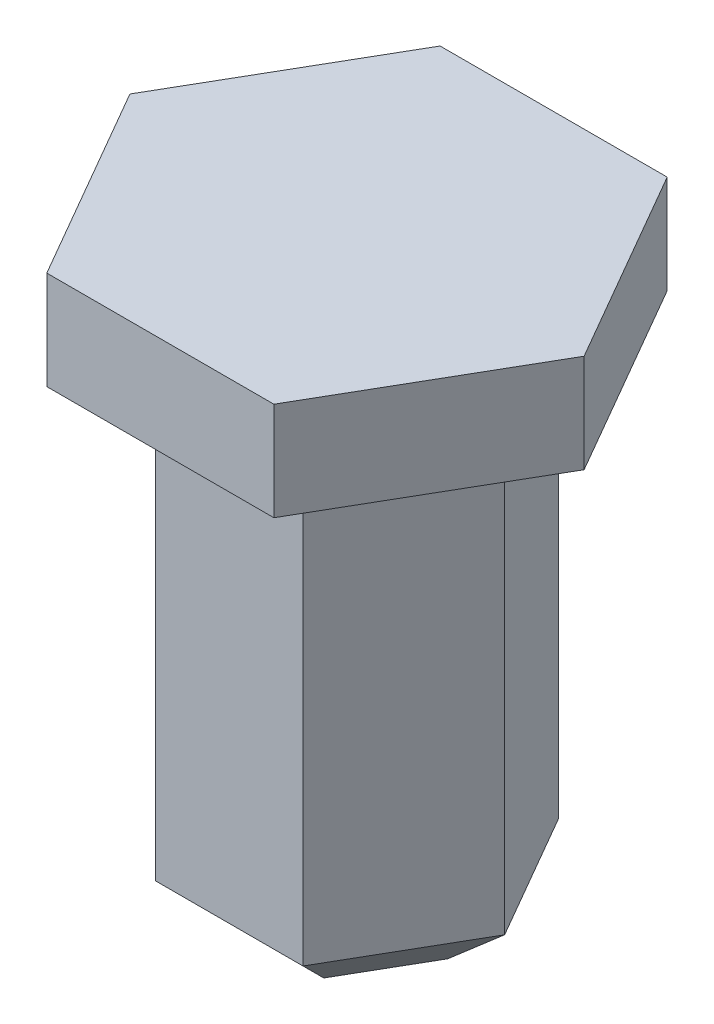
ISO-10303-21;
HEADER;
FILE_DESCRIPTION(('STEP AP214'),'2;1');
FILE_NAME('part.step','',(''),(''),'','','');
FILE_SCHEMA(('AUTOMOTIVE_DESIGN { 1 0 10303 214 1 1 1 1 }'));
ENDSEC;
DATA;
#1=APPLICATION_CONTEXT('core data for automotive mechanical design processes');
#2=APPLICATION_PROTOCOL_DEFINITION('international standard','automotive_design',2000,#1);
#3=PRODUCT_CONTEXT('',#1,'mechanical');
#4=PRODUCT('Part','Part','',(#3));
#5=PRODUCT_RELATED_PRODUCT_CATEGORY('part','',(#4));
#6=PRODUCT_DEFINITION_FORMATION('','',#4);
#7=PRODUCT_DEFINITION_CONTEXT('part definition',#1,'design');
#8=PRODUCT_DEFINITION('design','',#6,#7);
#9=PRODUCT_DEFINITION_SHAPE('','',#8);
#10=(LENGTH_UNIT() NAMED_UNIT(*) SI_UNIT(.MILLI.,.METRE.));
#11=(NAMED_UNIT(*) PLANE_ANGLE_UNIT() SI_UNIT($,.RADIAN.));
#12=(NAMED_UNIT(*) SI_UNIT($,.STERADIAN.) SOLID_ANGLE_UNIT());
#13=UNCERTAINTY_MEASURE_WITH_UNIT(LENGTH_MEASURE(1.E-05),#10,'distance_accuracy_value','');
#14=(GEOMETRIC_REPRESENTATION_CONTEXT(3) GLOBAL_UNCERTAINTY_ASSIGNED_CONTEXT((#13)) GLOBAL_UNIT_ASSIGNED_CONTEXT((#10,
#11,#12)) REPRESENTATION_CONTEXT('',''));
#15=CARTESIAN_POINT('',(0.,0.,0.));
#16=DIRECTION('',(0.,0.,1.));
#17=DIRECTION('',(1.,0.,0.));
#18=AXIS2_PLACEMENT_3D('',#15,#16,#17);
#19=CARTESIAN_POINT('',(0.750555349946526,5.,1.29999999999999));
#20=DIRECTION('',(-0.866025403784441,0.,-0.499999999999995));
#21=DIRECTION('',(-0.499999999999995,0.,0.866025403784441));
#22=AXIS2_PLACEMENT_3D('',#19,#20,#21);
#23=PLANE('',#22);
#24=DIRECTION('',(0.,-1.,0.));
#25=VECTOR('',#24,1.);
#26=CARTESIAN_POINT('',(0.750555349946526,5.,1.29999999999999));
#27=LINE('',#26,#25);
#28=CARTESIAN_POINT('',(0.750555349946526,5.,1.29999999999999));
#29=VERTEX_POINT('',#28);
#30=CARTESIAN_POINT('',(0.750555349946526,0.499999999999998,1.29999999999999));
#31=VERTEX_POINT('',#30);
#32=EDGE_CURVE('E193',#29,#31,#27,.T.);
#33=ORIENTED_EDGE('',*,*,#32,.T.);
#34=DIRECTION('',(0.499999999999995,0.,-0.866025403784441));
#35=VECTOR('',#34,1.);
#36=CARTESIAN_POINT('',(0.750555349946526,0.499999999999998,1.29999999999999));
#37=LINE('',#36,#35);
#38=CARTESIAN_POINT('',(1.50111069989302,0.499999999999998,0.));
#39=VERTEX_POINT('',#38);
#40=EDGE_CURVE('E11',#31,#39,#37,.T.);
#41=ORIENTED_EDGE('',*,*,#40,.T.);
#42=DIRECTION('',(0.,-1.,0.));
#43=VECTOR('',#42,1.);
#44=CARTESIAN_POINT('',(1.50111069989302,5.,0.));
#45=LINE('',#44,#43);
#46=CARTESIAN_POINT('',(1.50111069989302,5.,0.));
#47=VERTEX_POINT('',#46);
#48=EDGE_CURVE('E205',#47,#39,#45,.T.);
#49=ORIENTED_EDGE('',*,*,#48,.F.);
#50=DIRECTION('',(0.499999999999995,0.,-0.866025403784441));
#51=VECTOR('',#50,1.);
#52=CARTESIAN_POINT('',(0.750555349946526,5.,1.29999999999999));
#53=LINE('',#52,#51);
#54=EDGE_CURVE('E170',#29,#47,#53,.T.);
#55=ORIENTED_EDGE('',*,*,#54,.F.);
#56=EDGE_LOOP('',(#33,#41,#49,#55));
#57=FACE_BOUND('',#56,.T.);
#58=ADVANCED_FACE('F35',(#57),#23,.F.);
#59=CARTESIAN_POINT('',(1.50111069989302,5.,0.));
#60=DIRECTION('',(-0.866025403784438,0.,0.500000000000001));
#61=DIRECTION('',(0.500000000000001,0.,0.866025403784438));
#62=AXIS2_PLACEMENT_3D('',#59,#60,#61);
#63=PLANE('',#62);
#64=ORIENTED_EDGE('',*,*,#48,.T.);
#65=DIRECTION('',(-0.500000000000001,0.,-0.866025403784438));
#66=VECTOR('',#65,1.);
#67=CARTESIAN_POINT('',(1.50111069989302,0.499999999999998,0.));
#68=LINE('',#67,#66);
#69=CARTESIAN_POINT('',(0.750555349946508,0.499999999999998,-1.3));
#70=VERTEX_POINT('',#69);
#71=EDGE_CURVE('E208',#39,#70,#68,.T.);
#72=ORIENTED_EDGE('',*,*,#71,.T.);
#73=DIRECTION('',(0.,-1.,0.));
#74=VECTOR('',#73,1.);
#75=CARTESIAN_POINT('',(0.750555349946508,5.,-1.3));
#76=LINE('',#75,#74);
#77=CARTESIAN_POINT('',(0.750555349946508,5.,-1.3));
#78=VERTEX_POINT('',#77);
#79=EDGE_CURVE('E202',#78,#70,#76,.T.);
#80=ORIENTED_EDGE('',*,*,#79,.F.);
#81=DIRECTION('',(-0.500000000000001,0.,-0.866025403784438));
#82=VECTOR('',#81,1.);
#83=CARTESIAN_POINT('',(1.50111069989302,5.,0.));
#84=LINE('',#83,#82);
#85=EDGE_CURVE('E173',#47,#78,#84,.T.);
#86=ORIENTED_EDGE('',*,*,#85,.F.);
#87=EDGE_LOOP('',(#64,#72,#80,#86));
#88=FACE_BOUND('',#87,.T.);
#89=ADVANCED_FACE('F303',(#88),#63,.F.);
#90=CARTESIAN_POINT('',(0.750555349946508,5.,-1.3));
#91=DIRECTION('',(0.,0.,1.));
#92=DIRECTION('',(1.,0.,0.));
#93=AXIS2_PLACEMENT_3D('',#90,#91,#92);
#94=PLANE('',#93);
#95=ORIENTED_EDGE('',*,*,#79,.T.);
#96=DIRECTION('',(-1.,0.,0.));
#97=VECTOR('',#96,1.);
#98=CARTESIAN_POINT('',(0.750555349946508,0.499999999999998,-1.3));
#99=LINE('',#98,#97);
#100=CARTESIAN_POINT('',(-0.750555349946517,0.499999999999998,-1.29999999999999));
#101=VERTEX_POINT('',#100);
#102=EDGE_CURVE('E224',#70,#101,#99,.T.);
#103=ORIENTED_EDGE('',*,*,#102,.T.);
#104=DIRECTION('',(0.,-1.,0.));
#105=VECTOR('',#104,1.);
#106=CARTESIAN_POINT('',(-0.750555349946517,5.,-1.29999999999999));
#107=LINE('',#106,#105);
#108=CARTESIAN_POINT('',(-0.750555349946517,5.,-1.29999999999999));
#109=VERTEX_POINT('',#108);
#110=EDGE_CURVE('E199',#109,#101,#107,.T.);
#111=ORIENTED_EDGE('',*,*,#110,.F.);
#112=DIRECTION('',(-1.,0.,0.));
#113=VECTOR('',#112,1.);
#114=CARTESIAN_POINT('',(0.750555349946508,5.,-1.3));
#115=LINE('',#114,#113);
#116=EDGE_CURVE('E181',#78,#109,#115,.T.);
#117=ORIENTED_EDGE('',*,*,#116,.F.);
#118=EDGE_LOOP('',(#95,#103,#111,#117));
#119=FACE_BOUND('',#118,.T.);
#120=ADVANCED_FACE('F309',(#119),#94,.F.);
#121=CARTESIAN_POINT('',(-0.750555349946517,5.,-1.29999999999999));
#122=DIRECTION('',(0.866025403784442,0.,0.499999999999995));
#123=DIRECTION('',(0.499999999999995,0.,-0.866025403784442));
#124=AXIS2_PLACEMENT_3D('',#121,#122,#123);
#125=PLANE('',#124);
#126=ORIENTED_EDGE('',*,*,#110,.T.);
#127=DIRECTION('',(-0.499999999999995,0.,0.866025403784442));
#128=VECTOR('',#127,1.);
#129=CARTESIAN_POINT('',(-0.750555349946517,0.499999999999998,-1.29999999999999));
#130=LINE('',#129,#128);
#131=CARTESIAN_POINT('',(-1.50111069989302,0.499999999999998,0.));
#132=VERTEX_POINT('',#131);
#133=EDGE_CURVE('E226',#101,#132,#130,.T.);
#134=ORIENTED_EDGE('',*,*,#133,.T.);
#135=DIRECTION('',(0.,-1.,0.));
#136=VECTOR('',#135,1.);
#137=CARTESIAN_POINT('',(-1.50111069989302,5.,0.));
#138=LINE('',#137,#136);
#139=CARTESIAN_POINT('',(-1.50111069989302,5.,0.));
#140=VERTEX_POINT('',#139);
#141=EDGE_CURVE('E197',#140,#132,#138,.T.);
#142=ORIENTED_EDGE('',*,*,#141,.F.);
#143=DIRECTION('',(-0.499999999999995,0.,0.866025403784442));
#144=VECTOR('',#143,1.);
#145=CARTESIAN_POINT('',(-0.750555349946517,5.,-1.29999999999999));
#146=LINE('',#145,#144);
#147=EDGE_CURVE('E184',#109,#140,#146,.T.);
#148=ORIENTED_EDGE('',*,*,#147,.F.);
#149=EDGE_LOOP('',(#126,#134,#142,#148));
#150=FACE_BOUND('',#149,.T.);
#151=ADVANCED_FACE('F372',(#150),#125,.F.);
#152=CARTESIAN_POINT('',(-1.50111069989302,5.,0.));
#153=DIRECTION('',(0.866025403784434,0.,-0.500000000000007));
#154=DIRECTION('',(-0.500000000000007,0.,-0.866025403784435));
#155=AXIS2_PLACEMENT_3D('',#152,#153,#154);
#156=PLANE('',#155);
#157=ORIENTED_EDGE('',*,*,#141,.T.);
#158=DIRECTION('',(0.500000000000007,0.,0.866025403784435));
#159=VECTOR('',#158,1.);
#160=CARTESIAN_POINT('',(-1.50111069989302,0.499999999999998,0.));
#161=LINE('',#160,#159);
#162=CARTESIAN_POINT('',(-0.750555349946499,0.499999999999998,1.3));
#163=VERTEX_POINT('',#162);
#164=EDGE_CURVE('E60',#132,#163,#161,.T.);
#165=ORIENTED_EDGE('',*,*,#164,.T.);
#166=DIRECTION('',(0.,-1.,0.));
#167=VECTOR('',#166,1.);
#168=CARTESIAN_POINT('',(-0.750555349946499,5.,1.3));
#169=LINE('',#168,#167);
#170=CARTESIAN_POINT('',(-0.750555349946499,5.,1.3));
#171=VERTEX_POINT('',#170);
#172=EDGE_CURVE('E195',#171,#163,#169,.T.);
#173=ORIENTED_EDGE('',*,*,#172,.F.);
#174=DIRECTION('',(0.500000000000007,0.,0.866025403784434));
#175=VECTOR('',#174,1.);
#176=CARTESIAN_POINT('',(-1.50111069989302,5.,0.));
#177=LINE('',#176,#175);
#178=EDGE_CURVE('E187',#140,#171,#177,.T.);
#179=ORIENTED_EDGE('',*,*,#178,.F.);
#180=EDGE_LOOP('',(#157,#165,#173,#179));
#181=FACE_BOUND('',#180,.T.);
#182=ADVANCED_FACE('F370',(#181),#156,.F.);
#183=CARTESIAN_POINT('',(-0.750555349946499,5.,1.3));
#184=DIRECTION('',(0.,0.,-1.));
#185=DIRECTION('',(-1.,0.,0.));
#186=AXIS2_PLACEMENT_3D('',#183,#184,#185);
#187=PLANE('',#186);
#188=ORIENTED_EDGE('',*,*,#172,.T.);
#189=DIRECTION('',(1.,0.,0.));
#190=VECTOR('',#189,1.);
#191=CARTESIAN_POINT('',(-0.750555349946499,0.499999999999998,1.3));
#192=LINE('',#191,#190);
#193=EDGE_CURVE('E45',#163,#31,#192,.T.);
#194=ORIENTED_EDGE('',*,*,#193,.T.);
#195=ORIENTED_EDGE('',*,*,#32,.F.);
#196=DIRECTION('',(1.,0.,0.));
#197=VECTOR('',#196,1.);
#198=CARTESIAN_POINT('',(-0.750555349946499,5.,1.3));
#199=LINE('',#198,#197);
#200=EDGE_CURVE('E190',#171,#29,#199,.T.);
#201=ORIENTED_EDGE('',*,*,#200,.F.);
#202=EDGE_LOOP('',(#188,#194,#195,#201));
#203=FACE_BOUND('',#202,.T.);
#204=ADVANCED_FACE('F367',(#203),#187,.F.);
#205=CARTESIAN_POINT('',(0.,0.,0.));
#206=DIRECTION('',(0.,1.,0.));
#207=DIRECTION('',(0.,0.,1.));
#208=AXIS2_PLACEMENT_3D('',#205,#206,#207);
#209=PLANE('',#208);
#210=DIRECTION('',(1.,0.,0.));
#211=VECTOR('',#210,1.);
#212=CARTESIAN_POINT('',(0.,0.,-0.799999999999995));
#213=LINE('',#212,#211);
#214=CARTESIAN_POINT('',(-0.461880215351701,0.,-0.799999999999993));
#215=VERTEX_POINT('',#214);
#216=CARTESIAN_POINT('',(0.461880215351696,0.,-0.799999999999996));
#217=VERTEX_POINT('',#216);
#218=EDGE_CURVE('E219',#215,#217,#213,.T.);
#219=ORIENTED_EDGE('',*,*,#218,.T.);
#220=DIRECTION('',(0.500000000000001,0.,0.866025403784438));
#221=VECTOR('',#220,1.);
#222=CARTESIAN_POINT('',(0.692820323027546,0.,-0.399999999999998));
#223=LINE('',#222,#221);
#224=CARTESIAN_POINT('',(0.923760430703397,0.,0.));
#225=VERTEX_POINT('',#224);
#226=EDGE_CURVE('E221',#217,#225,#223,.T.);
#227=ORIENTED_EDGE('',*,*,#226,.T.);
#228=DIRECTION('',(-0.499999999999995,0.,0.866025403784441));
#229=VECTOR('',#228,1.);
#230=CARTESIAN_POINT('',(0.692820323027553,0.,0.399999999999996));
#231=LINE('',#230,#229);
#232=CARTESIAN_POINT('',(0.461880215351709,0.,0.79999999999999));
#233=VERTEX_POINT('',#232);
#234=EDGE_CURVE('E211',#225,#233,#231,.T.);
#235=ORIENTED_EDGE('',*,*,#234,.T.);
#236=DIRECTION('',(-1.,0.,0.));
#237=VECTOR('',#236,1.);
#238=CARTESIAN_POINT('',(0.,0.,0.799999999999994));
#239=LINE('',#238,#237);
#240=CARTESIAN_POINT('',(-0.46188021535169,0.,0.799999999999999));
#241=VERTEX_POINT('',#240);
#242=EDGE_CURVE('E213',#233,#241,#239,.T.);
#243=ORIENTED_EDGE('',*,*,#242,.T.);
#244=DIRECTION('',(-0.500000000000007,0.,-0.866025403784435));
#245=VECTOR('',#244,1.);
#246=CARTESIAN_POINT('',(-0.692820323027543,0.,0.400000000000003));
#247=LINE('',#246,#245);
#248=CARTESIAN_POINT('',(-0.923760430703396,0.,0.));
#249=VERTEX_POINT('',#248);
#250=EDGE_CURVE('E215',#241,#249,#247,.T.);
#251=ORIENTED_EDGE('',*,*,#250,.T.);
#252=DIRECTION('',(0.499999999999995,0.,-0.866025403784442));
#253=VECTOR('',#252,1.);
#254=CARTESIAN_POINT('',(-0.692820323027549,0.,-0.399999999999993));
#255=LINE('',#254,#253);
#256=EDGE_CURVE('E217',#249,#215,#255,.T.);
#257=ORIENTED_EDGE('',*,*,#256,.T.);
#258=EDGE_LOOP('',(#219,#227,#235,#243,#251,#257));
#259=FACE_BOUND('',#258,.T.);
#260=ADVANCED_FACE('F357',(#259),#209,.F.);
#261=CARTESIAN_POINT('',(0.,5.,0.));
#262=DIRECTION('',(0.,1.,0.));
#263=DIRECTION('',(0.,0.,1.));
#264=AXIS2_PLACEMENT_3D('',#261,#262,#263);
#265=PLANE('',#264);
#266=DIRECTION('',(0.499999999999999,0.,-0.866025403784439));
#267=VECTOR('',#266,1.);
#268=CARTESIAN_POINT('',(1.15470053837925,5.,2.));
#269=LINE('',#268,#267);
#270=CARTESIAN_POINT('',(1.15470053837925,5.,2.));
#271=VERTEX_POINT('',#270);
#272=CARTESIAN_POINT('',(2.3094010767585,5.,0.));
#273=VERTEX_POINT('',#272);
#274=EDGE_CURVE('E169',#271,#273,#269,.T.);
#275=ORIENTED_EDGE('',*,*,#274,.F.);
#276=DIRECTION('',(1.,0.,0.));
#277=VECTOR('',#276,1.);
#278=CARTESIAN_POINT('',(-1.15470053837925,5.,2.));
#279=LINE('',#278,#277);
#280=CARTESIAN_POINT('',(-1.15470053837925,5.,2.));
#281=VERTEX_POINT('',#280);
#282=EDGE_CURVE('E165',#281,#271,#279,.T.);
#283=ORIENTED_EDGE('',*,*,#282,.F.);
#284=DIRECTION('',(0.5,0.,0.866025403784438));
#285=VECTOR('',#284,1.);
#286=CARTESIAN_POINT('',(-2.3094010767585,5.,0.));
#287=LINE('',#286,#285);
#288=CARTESIAN_POINT('',(-2.3094010767585,5.,0.));
#289=VERTEX_POINT('',#288);
#290=EDGE_CURVE('E259',#289,#281,#287,.T.);
#291=ORIENTED_EDGE('',*,*,#290,.F.);
#292=DIRECTION('',(-0.5,0.,0.866025403784439));
#293=VECTOR('',#292,1.);
#294=CARTESIAN_POINT('',(-1.15470053837925,5.,-2.));
#295=LINE('',#294,#293);
#296=CARTESIAN_POINT('',(-1.15470053837925,5.,-2.));
#297=VERTEX_POINT('',#296);
#298=EDGE_CURVE('E257',#297,#289,#295,.T.);
#299=ORIENTED_EDGE('',*,*,#298,.F.);
#300=DIRECTION('',(-1.,0.,0.));
#301=VECTOR('',#300,1.);
#302=CARTESIAN_POINT('',(1.15470053837925,5.,-2.));
#303=LINE('',#302,#301);
#304=CARTESIAN_POINT('',(1.15470053837925,5.,-2.));
#305=VERTEX_POINT('',#304);
#306=EDGE_CURVE('E251',#305,#297,#303,.T.);
#307=ORIENTED_EDGE('',*,*,#306,.F.);
#308=DIRECTION('',(-0.5,0.,-0.866025403784438));
#309=VECTOR('',#308,1.);
#310=CARTESIAN_POINT('',(2.3094010767585,5.,0.));
#311=LINE('',#310,#309);
#312=EDGE_CURVE('E249',#273,#305,#311,.T.);
#313=ORIENTED_EDGE('',*,*,#312,.F.);
#314=EDGE_LOOP('',(#275,#283,#291,#299,#307,#313));
#315=FACE_BOUND('',#314,.T.);
#316=ORIENTED_EDGE('',*,*,#200,.T.);
#317=ORIENTED_EDGE('',*,*,#54,.T.);
#318=ORIENTED_EDGE('',*,*,#85,.T.);
#319=ORIENTED_EDGE('',*,*,#116,.T.);
#320=ORIENTED_EDGE('',*,*,#147,.T.);
#321=ORIENTED_EDGE('',*,*,#178,.T.);
#322=EDGE_LOOP('',(#316,#317,#318,#319,#320,#321));
#323=FACE_BOUND('',#322,.T.);
#324=ADVANCED_FACE('F281',(#315,#323),#265,.F.);
#325=CARTESIAN_POINT('',(1.15470053837925,6.,2.));
#326=DIRECTION('',(-0.866025403784439,0.,-0.499999999999999));
#327=DIRECTION('',(-0.499999999999999,0.,0.866025403784439));
#328=AXIS2_PLACEMENT_3D('',#325,#326,#327);
#329=PLANE('',#328);
#330=ORIENTED_EDGE('',*,*,#274,.T.);
#331=DIRECTION('',(0.,-1.,0.));
#332=VECTOR('',#331,1.);
#333=CARTESIAN_POINT('',(2.3094010767585,6.,0.));
#334=LINE('',#333,#332);
#335=CARTESIAN_POINT('',(2.3094010767585,6.,0.));
#336=VERTEX_POINT('',#335);
#337=EDGE_CURVE('E149',#336,#273,#334,.T.);
#338=ORIENTED_EDGE('',*,*,#337,.F.);
#339=DIRECTION('',(0.499999999999999,0.,-0.866025403784439));
#340=VECTOR('',#339,1.);
#341=CARTESIAN_POINT('',(1.15470053837925,6.,2.));
#342=LINE('',#341,#340);
#343=CARTESIAN_POINT('',(1.15470053837925,6.,2.));
#344=VERTEX_POINT('',#343);
#345=EDGE_CURVE('E156',#344,#336,#342,.T.);
#346=ORIENTED_EDGE('',*,*,#345,.F.);
#347=DIRECTION('',(0.,-1.,0.));
#348=VECTOR('',#347,1.);
#349=CARTESIAN_POINT('',(1.15470053837925,6.,2.));
#350=LINE('',#349,#348);
#351=EDGE_CURVE('E262',#344,#271,#350,.T.);
#352=ORIENTED_EDGE('',*,*,#351,.T.);
#353=EDGE_LOOP('',(#330,#338,#346,#352));
#354=FACE_BOUND('',#353,.T.);
#355=ADVANCED_FACE('F167',(#354),#329,.F.);
#356=CARTESIAN_POINT('',(2.3094010767585,6.,0.));
#357=DIRECTION('',(-0.866025403784439,0.,0.5));
#358=DIRECTION('',(0.5,0.,0.866025403784439));
#359=AXIS2_PLACEMENT_3D('',#356,#357,#358);
#360=PLANE('',#359);
#361=ORIENTED_EDGE('',*,*,#312,.T.);
#362=DIRECTION('',(0.,-1.,0.));
#363=VECTOR('',#362,1.);
#364=CARTESIAN_POINT('',(1.15470053837925,6.,-2.));
#365=LINE('',#364,#363);
#366=CARTESIAN_POINT('',(1.15470053837925,6.,-2.));
#367=VERTEX_POINT('',#366);
#368=EDGE_CURVE('E152',#367,#305,#365,.T.);
#369=ORIENTED_EDGE('',*,*,#368,.F.);
#370=DIRECTION('',(-0.5,0.,-0.866025403784438));
#371=VECTOR('',#370,1.);
#372=CARTESIAN_POINT('',(2.3094010767585,6.,0.));
#373=LINE('',#372,#371);
#374=EDGE_CURVE('E145',#336,#367,#373,.T.);
#375=ORIENTED_EDGE('',*,*,#374,.F.);
#376=ORIENTED_EDGE('',*,*,#337,.T.);
#377=EDGE_LOOP('',(#361,#369,#375,#376));
#378=FACE_BOUND('',#377,.T.);
#379=ADVANCED_FACE('F147',(#378),#360,.F.);
#380=CARTESIAN_POINT('',(1.15470053837925,6.,-2.));
#381=DIRECTION('',(0.,0.,1.));
#382=DIRECTION('',(1.,0.,0.));
#383=AXIS2_PLACEMENT_3D('',#380,#381,#382);
#384=PLANE('',#383);
#385=ORIENTED_EDGE('',*,*,#306,.T.);
#386=DIRECTION('',(0.,-1.,0.));
#387=VECTOR('',#386,1.);
#388=CARTESIAN_POINT('',(-1.15470053837925,6.,-2.));
#389=LINE('',#388,#387);
#390=CARTESIAN_POINT('',(-1.15470053837925,6.,-2.));
#391=VERTEX_POINT('',#390);
#392=EDGE_CURVE('E175',#391,#297,#389,.T.);
#393=ORIENTED_EDGE('',*,*,#392,.F.);
#394=DIRECTION('',(-1.,0.,0.));
#395=VECTOR('',#394,1.);
#396=CARTESIAN_POINT('',(1.15470053837925,6.,-2.));
#397=LINE('',#396,#395);
#398=EDGE_CURVE('E155',#367,#391,#397,.T.);
#399=ORIENTED_EDGE('',*,*,#398,.F.);
#400=ORIENTED_EDGE('',*,*,#368,.T.);
#401=EDGE_LOOP('',(#385,#393,#399,#400));
#402=FACE_BOUND('',#401,.T.);
#403=ADVANCED_FACE('F293',(#402),#384,.F.);
#404=CARTESIAN_POINT('',(-1.15470053837925,6.,-2.));
#405=DIRECTION('',(0.866025403784439,0.,0.5));
#406=DIRECTION('',(0.5,0.,-0.866025403784439));
#407=AXIS2_PLACEMENT_3D('',#404,#405,#406);
#408=PLANE('',#407);
#409=ORIENTED_EDGE('',*,*,#298,.T.);
#410=DIRECTION('',(0.,-1.,0.));
#411=VECTOR('',#410,1.);
#412=CARTESIAN_POINT('',(-2.3094010767585,6.,0.));
#413=LINE('',#412,#411);
#414=CARTESIAN_POINT('',(-2.3094010767585,6.,0.));
#415=VERTEX_POINT('',#414);
#416=EDGE_CURVE('E267',#415,#289,#413,.T.);
#417=ORIENTED_EDGE('',*,*,#416,.F.);
#418=DIRECTION('',(-0.5,0.,0.866025403784439));
#419=VECTOR('',#418,1.);
#420=CARTESIAN_POINT('',(-1.15470053837925,6.,-2.));
#421=LINE('',#420,#419);
#422=EDGE_CURVE('E276',#391,#415,#421,.T.);
#423=ORIENTED_EDGE('',*,*,#422,.F.);
#424=ORIENTED_EDGE('',*,*,#392,.T.);
#425=EDGE_LOOP('',(#409,#417,#423,#424));
#426=FACE_BOUND('',#425,.T.);
#427=ADVANCED_FACE('F274',(#426),#408,.F.);
#428=CARTESIAN_POINT('',(-2.3094010767585,6.,0.));
#429=DIRECTION('',(0.866025403784439,0.,-0.5));
#430=DIRECTION('',(-0.5,0.,-0.866025403784438));
#431=AXIS2_PLACEMENT_3D('',#428,#429,#430);
#432=PLANE('',#431);
#433=ORIENTED_EDGE('',*,*,#290,.T.);
#434=DIRECTION('',(0.,-1.,0.));
#435=VECTOR('',#434,1.);
#436=CARTESIAN_POINT('',(-1.15470053837925,6.,2.));
#437=LINE('',#436,#435);
#438=CARTESIAN_POINT('',(-1.15470053837925,6.,2.));
#439=VERTEX_POINT('',#438);
#440=EDGE_CURVE('E264',#439,#281,#437,.T.);
#441=ORIENTED_EDGE('',*,*,#440,.F.);
#442=DIRECTION('',(0.5,0.,0.866025403784438));
#443=VECTOR('',#442,1.);
#444=CARTESIAN_POINT('',(-2.3094010767585,6.,0.));
#445=LINE('',#444,#443);
#446=EDGE_CURVE('E290',#415,#439,#445,.T.);
#447=ORIENTED_EDGE('',*,*,#446,.F.);
#448=ORIENTED_EDGE('',*,*,#416,.T.);
#449=EDGE_LOOP('',(#433,#441,#447,#448));
#450=FACE_BOUND('',#449,.T.);
#451=ADVANCED_FACE('F286',(#450),#432,.F.);
#452=CARTESIAN_POINT('',(-1.15470053837925,6.,2.));
#453=DIRECTION('',(0.,0.,-1.));
#454=DIRECTION('',(-1.,0.,0.));
#455=AXIS2_PLACEMENT_3D('',#452,#453,#454);
#456=PLANE('',#455);
#457=ORIENTED_EDGE('',*,*,#282,.T.);
#458=ORIENTED_EDGE('',*,*,#351,.F.);
#459=DIRECTION('',(1.,0.,0.));
#460=VECTOR('',#459,1.);
#461=CARTESIAN_POINT('',(-1.15470053837925,6.,2.));
#462=LINE('',#461,#460);
#463=EDGE_CURVE('E161',#439,#344,#462,.T.);
#464=ORIENTED_EDGE('',*,*,#463,.F.);
#465=ORIENTED_EDGE('',*,*,#440,.T.);
#466=EDGE_LOOP('',(#457,#458,#464,#465));
#467=FACE_BOUND('',#466,.T.);
#468=ADVANCED_FACE('F289',(#467),#456,.F.);
#469=CARTESIAN_POINT('',(0.,6.,0.));
#470=DIRECTION('',(0.,1.,0.));
#471=DIRECTION('',(0.,0.,1.));
#472=AXIS2_PLACEMENT_3D('',#469,#470,#471);
#473=PLANE('',#472);
#474=ORIENTED_EDGE('',*,*,#345,.T.);
#475=ORIENTED_EDGE('',*,*,#374,.T.);
#476=ORIENTED_EDGE('',*,*,#398,.T.);
#477=ORIENTED_EDGE('',*,*,#422,.T.);
#478=ORIENTED_EDGE('',*,*,#446,.T.);
#479=ORIENTED_EDGE('',*,*,#463,.T.);
#480=EDGE_LOOP('',(#474,#475,#476,#477,#478,#479));
#481=FACE_BOUND('',#480,.T.);
#482=ADVANCED_FACE('F159',(#481),#473,.T.);
#483=CARTESIAN_POINT('',(-1.50111069989302,0.499999999999998,0.));
#484=DIRECTION('',(0.61237243569579,0.707106781186549,-0.353553390593278));
#485=DIRECTION('',(0.500000000000007,0.,0.866025403784435));
#486=AXIS2_PLACEMENT_3D('',#483,#484,#485);
#487=PLANE('',#486);
#488=DIRECTION('',(0.755928946018456,-0.654653670707975,0.));
#489=VECTOR('',#488,1.);
#490=CARTESIAN_POINT('',(-1.50111069989302,0.499999999999998,0.));
#491=LINE('',#490,#489);
#492=EDGE_CURVE('E239',#249,#132,#491,.F.);
#493=ORIENTED_EDGE('',*,*,#492,.F.);
#494=ORIENTED_EDGE('',*,*,#250,.F.);
#495=DIRECTION('',(0.377964473009222,-0.654653670707975,-0.654653670707982));
#496=VECTOR('',#495,1.);
#497=CARTESIAN_POINT('',(-0.750555349946499,0.499999999999998,1.3));
#498=LINE('',#497,#496);
#499=EDGE_CURVE('E40',#163,#241,#498,.T.);
#500=ORIENTED_EDGE('',*,*,#499,.F.);
#501=ORIENTED_EDGE('',*,*,#164,.F.);
#502=EDGE_LOOP('',(#493,#494,#500,#501));
#503=FACE_BOUND('',#502,.T.);
#504=ADVANCED_FACE('F38',(#503),#487,.F.);
#505=CARTESIAN_POINT('',(-0.750555349946499,0.499999999999998,1.3));
#506=DIRECTION('',(0.,0.707106781186549,-0.707106781186546));
#507=DIRECTION('',(1.,0.,0.));
#508=AXIS2_PLACEMENT_3D('',#505,#506,#507);
#509=PLANE('',#508);
#510=ORIENTED_EDGE('',*,*,#499,.T.);
#511=ORIENTED_EDGE('',*,*,#242,.F.);
#512=DIRECTION('',(-0.377964473009233,-0.654653670707976,-0.654653670707975));
#513=VECTOR('',#512,1.);
#514=CARTESIAN_POINT('',(0.750555349946526,0.499999999999998,1.29999999999999));
#515=LINE('',#514,#513);
#516=EDGE_CURVE('E237',#31,#233,#515,.T.);
#517=ORIENTED_EDGE('',*,*,#516,.F.);
#518=ORIENTED_EDGE('',*,*,#193,.F.);
#519=EDGE_LOOP('',(#510,#511,#517,#518));
#520=FACE_BOUND('',#519,.T.);
#521=ADVANCED_FACE('F341',(#520),#509,.F.);
#522=CARTESIAN_POINT('',(-0.750555349946517,0.499999999999998,-1.29999999999999));
#523=DIRECTION('',(0.612372435695795,0.707106781186549,0.35355339059327));
#524=DIRECTION('',(-0.499999999999995,0.,0.866025403784442));
#525=AXIS2_PLACEMENT_3D('',#522,#523,#524);
#526=PLANE('',#525);
#527=ORIENTED_EDGE('',*,*,#492,.T.);
#528=ORIENTED_EDGE('',*,*,#133,.F.);
#529=DIRECTION('',(0.377964473009231,-0.654653670707975,0.654653670707977));
#530=VECTOR('',#529,1.);
#531=CARTESIAN_POINT('',(-0.750555349946517,0.499999999999998,-1.29999999999999));
#532=LINE('',#531,#530);
#533=EDGE_CURVE('E234',#215,#101,#532,.F.);
#534=ORIENTED_EDGE('',*,*,#533,.F.);
#535=ORIENTED_EDGE('',*,*,#256,.F.);
#536=EDGE_LOOP('',(#527,#528,#534,#535));
#537=FACE_BOUND('',#536,.T.);
#538=ADVANCED_FACE('F335',(#537),#526,.F.);
#539=CARTESIAN_POINT('',(0.750555349946526,0.499999999999998,1.29999999999999));
#540=DIRECTION('',(-0.612372435695795,0.707106781186549,-0.35355339059327));
#541=DIRECTION('',(0.499999999999995,0.,-0.866025403784441));
#542=AXIS2_PLACEMENT_3D('',#539,#540,#541);
#543=PLANE('',#542);
#544=ORIENTED_EDGE('',*,*,#516,.T.);
#545=ORIENTED_EDGE('',*,*,#234,.F.);
#546=DIRECTION('',(0.755928946018455,0.654653670707976,0.));
#547=VECTOR('',#546,1.);
#548=CARTESIAN_POINT('',(1.07222192849502,0.128571428571433,0.));
#549=LINE('',#548,#547);
#550=EDGE_CURVE('E232',#39,#225,#549,.F.);
#551=ORIENTED_EDGE('',*,*,#550,.F.);
#552=ORIENTED_EDGE('',*,*,#40,.F.);
#553=EDGE_LOOP('',(#544,#545,#551,#552));
#554=FACE_BOUND('',#553,.T.);
#555=ADVANCED_FACE('F328',(#554),#543,.F.);
#556=CARTESIAN_POINT('',(0.750555349946508,0.499999999999998,-1.3));
#557=DIRECTION('',(0.,0.707106781186549,0.707106781186546));
#558=DIRECTION('',(-1.,0.,0.));
#559=AXIS2_PLACEMENT_3D('',#556,#557,#558);
#560=PLANE('',#559);
#561=ORIENTED_EDGE('',*,*,#533,.T.);
#562=ORIENTED_EDGE('',*,*,#102,.F.);
#563=DIRECTION('',(-0.377964473009227,-0.654653670707975,0.654653670707979));
#564=VECTOR('',#563,1.);
#565=CARTESIAN_POINT('',(0.750555349946508,0.499999999999998,-1.3));
#566=LINE('',#565,#564);
#567=EDGE_CURVE('E230',#217,#70,#566,.F.);
#568=ORIENTED_EDGE('',*,*,#567,.F.);
#569=ORIENTED_EDGE('',*,*,#218,.F.);
#570=EDGE_LOOP('',(#561,#562,#568,#569));
#571=FACE_BOUND('',#570,.T.);
#572=ADVANCED_FACE('F321',(#571),#560,.F.);
#573=CARTESIAN_POINT('',(1.50111069989302,0.499999999999998,0.));
#574=DIRECTION('',(-0.612372435695793,0.707106781186549,0.353553390593274));
#575=DIRECTION('',(-0.500000000000001,0.,-0.866025403784438));
#576=AXIS2_PLACEMENT_3D('',#573,#574,#575);
#577=PLANE('',#576);
#578=ORIENTED_EDGE('',*,*,#550,.T.);
#579=ORIENTED_EDGE('',*,*,#226,.F.);
#580=ORIENTED_EDGE('',*,*,#567,.T.);
#581=ORIENTED_EDGE('',*,*,#71,.F.);
#582=EDGE_LOOP('',(#578,#579,#580,#581));
#583=FACE_BOUND('',#582,.T.);
#584=ADVANCED_FACE('F315',(#583),#577,.F.);
#585=CLOSED_SHELL('',(#58,#89,#120,#151,#182,#204,#260,#324,#355,#379,#403,#427,#451,#468,#482,
#504,#521,#538,#555,#572,#584));
#586=MANIFOLD_SOLID_BREP('B2',#585);
#587=ADVANCED_BREP_SHAPE_REPRESENTATION('',(#18,#586),#14);
#588=SHAPE_DEFINITION_REPRESENTATION(#9,#587);
ENDSEC;
END-ISO-10303-21;
